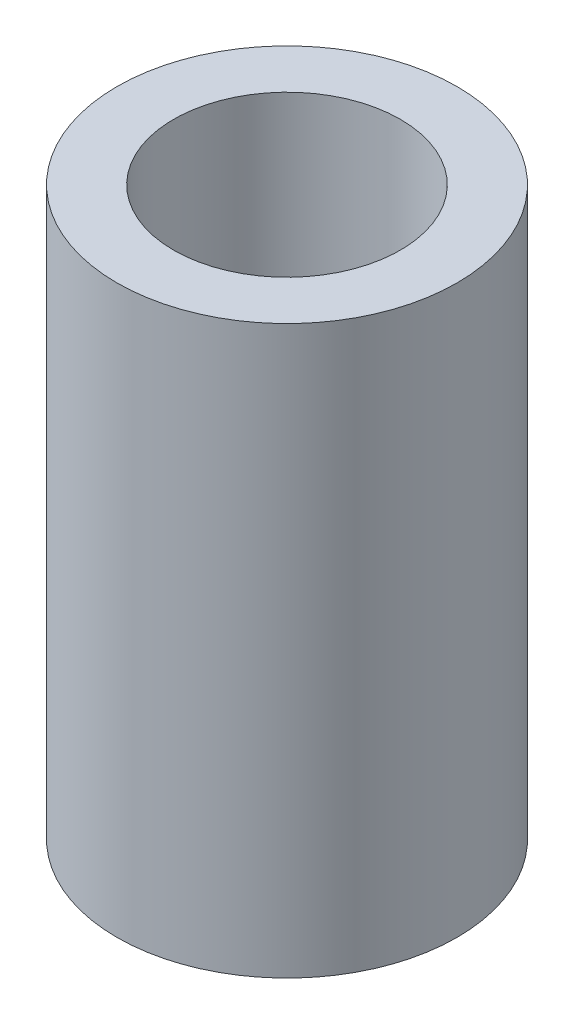
ISO-10303-21;
HEADER;
FILE_DESCRIPTION(('STEP AP214'),'2;1');
FILE_NAME('part.step','',(''),(''),'','','');
FILE_SCHEMA(('AUTOMOTIVE_DESIGN { 1 0 10303 214 1 1 1 1 }'));
ENDSEC;
DATA;
#1=APPLICATION_CONTEXT('core data for automotive mechanical design processes');
#2=APPLICATION_PROTOCOL_DEFINITION('international standard','automotive_design',2000,#1);
#3=PRODUCT_CONTEXT('',#1,'mechanical');
#4=PRODUCT('Part','Part','',(#3));
#5=PRODUCT_RELATED_PRODUCT_CATEGORY('part','',(#4));
#6=PRODUCT_DEFINITION_FORMATION('','',#4);
#7=PRODUCT_DEFINITION_CONTEXT('part definition',#1,'design');
#8=PRODUCT_DEFINITION('design','',#6,#7);
#9=PRODUCT_DEFINITION_SHAPE('','',#8);
#10=(LENGTH_UNIT() NAMED_UNIT(*) SI_UNIT(.MILLI.,.METRE.));
#11=(NAMED_UNIT(*) PLANE_ANGLE_UNIT() SI_UNIT($,.RADIAN.));
#12=(NAMED_UNIT(*) SI_UNIT($,.STERADIAN.) SOLID_ANGLE_UNIT());
#13=UNCERTAINTY_MEASURE_WITH_UNIT(LENGTH_MEASURE(1.E-05),#10,'distance_accuracy_value','');
#14=(GEOMETRIC_REPRESENTATION_CONTEXT(3) GLOBAL_UNCERTAINTY_ASSIGNED_CONTEXT((#13)) GLOBAL_UNIT_ASSIGNED_CONTEXT((#10,
#11,#12)) REPRESENTATION_CONTEXT('',''));
#15=CARTESIAN_POINT('',(0.,0.,0.));
#16=DIRECTION('',(0.,0.,1.));
#17=DIRECTION('',(1.,0.,0.));
#18=AXIS2_PLACEMENT_3D('',#15,#16,#17);
#19=CARTESIAN_POINT('',(0.,12.7,0.));
#20=DIRECTION('',(0.,-1.,0.));
#21=DIRECTION('',(0.,0.,-1.));
#22=AXIS2_PLACEMENT_3D('',#19,#20,#21);
#23=CYLINDRICAL_SURFACE('',#22,3.81);
#24=CARTESIAN_POINT('',(0.,12.7,0.));
#25=DIRECTION('',(0.,1.,0.));
#26=DIRECTION('',(0.,0.,1.));
#27=AXIS2_PLACEMENT_3D('',#24,#25,#26);
#28=CIRCLE('',#27,3.81);
#29=CARTESIAN_POINT('',(0.,12.7,3.81));
#30=VERTEX_POINT('',#29);
#31=EDGE_CURVE('E10',#30,#30,#28,.T.);
#32=ORIENTED_EDGE('',*,*,#31,.F.);
#33=EDGE_LOOP('',(#32));
#34=FACE_BOUND('',#33,.T.);
#35=CARTESIAN_POINT('',(0.,0.,0.));
#36=DIRECTION('',(0.,1.,0.));
#37=DIRECTION('',(0.,0.,1.));
#38=AXIS2_PLACEMENT_3D('',#35,#36,#37);
#39=CIRCLE('',#38,3.81);
#40=CARTESIAN_POINT('',(0.,0.,3.81));
#41=VERTEX_POINT('',#40);
#42=EDGE_CURVE('E33',#41,#41,#39,.T.);
#43=ORIENTED_EDGE('',*,*,#42,.T.);
#44=EDGE_LOOP('',(#43));
#45=FACE_BOUND('',#44,.T.);
#46=ADVANCED_FACE('F30',(#34,#45),#23,.T.);
#47=CARTESIAN_POINT('',(0.,12.7,0.));
#48=DIRECTION('',(0.,1.,0.));
#49=DIRECTION('',(0.,0.,1.));
#50=AXIS2_PLACEMENT_3D('',#47,#48,#49);
#51=PLANE('',#50);
#52=CARTESIAN_POINT('',(0.,12.7,0.));
#53=DIRECTION('',(0.,1.,0.));
#54=DIRECTION('',(0.,0.,1.));
#55=AXIS2_PLACEMENT_3D('',#52,#53,#54);
#56=CIRCLE('',#55,2.54);
#57=CARTESIAN_POINT('',(0.,12.7,2.54));
#58=VERTEX_POINT('',#57);
#59=EDGE_CURVE('E42',#58,#58,#56,.T.);
#60=ORIENTED_EDGE('',*,*,#59,.F.);
#61=EDGE_LOOP('',(#60));
#62=FACE_BOUND('',#61,.T.);
#63=ORIENTED_EDGE('',*,*,#31,.T.);
#64=EDGE_LOOP('',(#63));
#65=FACE_BOUND('',#64,.T.);
#66=ADVANCED_FACE('F57',(#62,#65),#51,.T.);
#67=CARTESIAN_POINT('',(0.,0.,0.));
#68=DIRECTION('',(0.,1.,0.));
#69=DIRECTION('',(0.,0.,1.));
#70=AXIS2_PLACEMENT_3D('',#67,#68,#69);
#71=PLANE('',#70);
#72=CARTESIAN_POINT('',(0.,0.,0.));
#73=DIRECTION('',(0.,1.,0.));
#74=DIRECTION('',(0.,0.,1.));
#75=AXIS2_PLACEMENT_3D('',#72,#73,#74);
#76=CIRCLE('',#75,2.54);
#77=CARTESIAN_POINT('',(0.,0.,2.54));
#78=VERTEX_POINT('',#77);
#79=EDGE_CURVE('E40',#78,#78,#76,.T.);
#80=ORIENTED_EDGE('',*,*,#79,.T.);
#81=EDGE_LOOP('',(#80));
#82=FACE_BOUND('',#81,.T.);
#83=ORIENTED_EDGE('',*,*,#42,.F.);
#84=EDGE_LOOP('',(#83));
#85=FACE_BOUND('',#84,.T.);
#86=ADVANCED_FACE('F48',(#82,#85),#71,.F.);
#87=CARTESIAN_POINT('',(0.,0.,0.));
#88=DIRECTION('',(0.,1.,0.));
#89=DIRECTION('',(0.,0.,1.));
#90=AXIS2_PLACEMENT_3D('',#87,#88,#89);
#91=CYLINDRICAL_SURFACE('',#90,2.54);
#92=ORIENTED_EDGE('',*,*,#79,.F.);
#93=EDGE_LOOP('',(#92));
#94=FACE_BOUND('',#93,.T.);
#95=ORIENTED_EDGE('',*,*,#59,.T.);
#96=EDGE_LOOP('',(#95));
#97=FACE_BOUND('',#96,.T.);
#98=ADVANCED_FACE('F51',(#94,#97),#91,.F.);
#99=CLOSED_SHELL('',(#46,#66,#86,#98));
#100=MANIFOLD_SOLID_BREP('B2',#99);
#101=ADVANCED_BREP_SHAPE_REPRESENTATION('',(#18,#100),#14);
#102=SHAPE_DEFINITION_REPRESENTATION(#9,#101);
ENDSEC;
END-ISO-10303-21;
